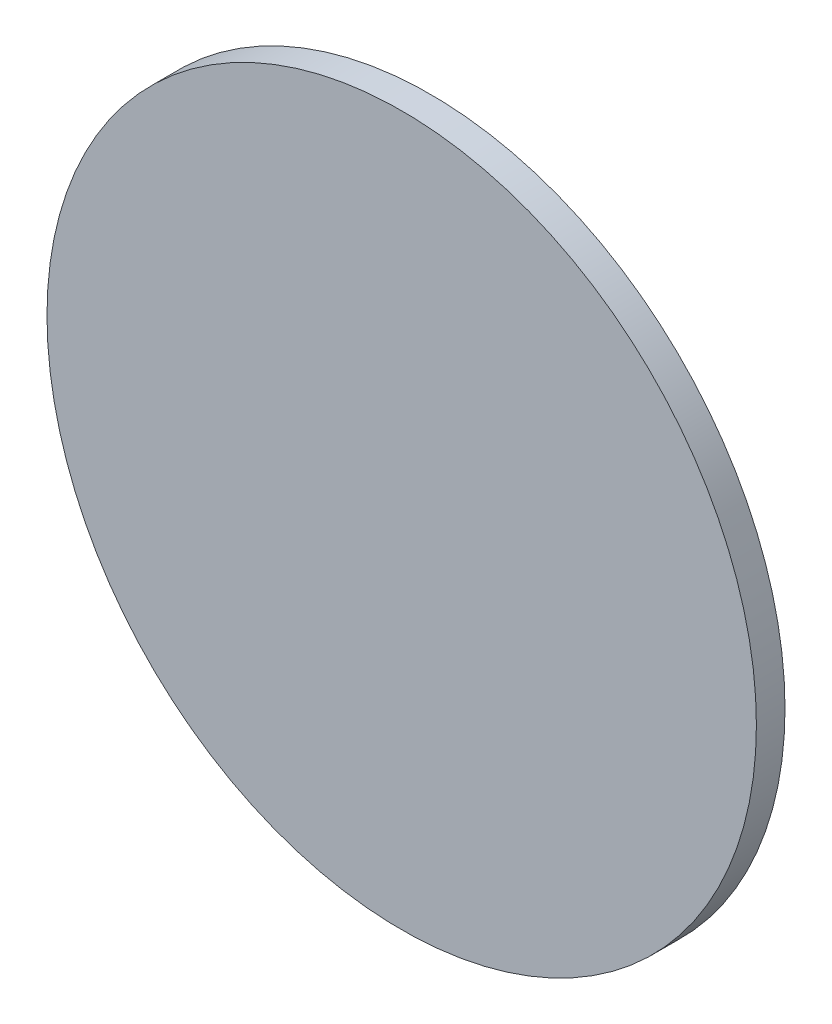
ISO-10303-21;
HEADER;
FILE_DESCRIPTION(('STEP AP214'),'2;1');
FILE_NAME('part.step','',(''),(''),'','','');
FILE_SCHEMA(('AUTOMOTIVE_DESIGN { 1 0 10303 214 1 1 1 1 }'));
ENDSEC;
DATA;
#1=APPLICATION_CONTEXT('core data for automotive mechanical design processes');
#2=APPLICATION_PROTOCOL_DEFINITION('international standard','automotive_design',2000,#1);
#3=PRODUCT_CONTEXT('',#1,'mechanical');
#4=PRODUCT('Part','Part','',(#3));
#5=PRODUCT_RELATED_PRODUCT_CATEGORY('part','',(#4));
#6=PRODUCT_DEFINITION_FORMATION('','',#4);
#7=PRODUCT_DEFINITION_CONTEXT('part definition',#1,'design');
#8=PRODUCT_DEFINITION('design','',#6,#7);
#9=PRODUCT_DEFINITION_SHAPE('','',#8);
#10=(LENGTH_UNIT() NAMED_UNIT(*) SI_UNIT(.MILLI.,.METRE.));
#11=(NAMED_UNIT(*) PLANE_ANGLE_UNIT() SI_UNIT($,.RADIAN.));
#12=(NAMED_UNIT(*) SI_UNIT($,.STERADIAN.) SOLID_ANGLE_UNIT());
#13=UNCERTAINTY_MEASURE_WITH_UNIT(LENGTH_MEASURE(1.E-05),#10,'distance_accuracy_value','');
#14=(GEOMETRIC_REPRESENTATION_CONTEXT(3) GLOBAL_UNCERTAINTY_ASSIGNED_CONTEXT((#13)) GLOBAL_UNIT_ASSIGNED_CONTEXT((#10,
#11,#12)) REPRESENTATION_CONTEXT('',''));
#15=CARTESIAN_POINT('',(0.,0.,0.));
#16=DIRECTION('',(0.,0.,1.));
#17=DIRECTION('',(1.,0.,0.));
#18=AXIS2_PLACEMENT_3D('',#15,#16,#17);
#19=CARTESIAN_POINT('',(62.,0.,0.));
#20=DIRECTION('',(0.,0.,-1.));
#21=DIRECTION('',(-1.,0.,0.));
#22=AXIS2_PLACEMENT_3D('',#19,#20,#21);
#23=PLANE('',#22);
#24=CARTESIAN_POINT('',(0.,0.,0.));
#25=DIRECTION('',(0.,0.,-1.));
#26=DIRECTION('',(-1.,0.,0.));
#27=AXIS2_PLACEMENT_3D('',#24,#25,#26);
#28=CIRCLE('',#27,62.);
#29=CARTESIAN_POINT('',(-62.,0.,0.));
#30=VERTEX_POINT('',#29);
#31=EDGE_CURVE('E80',#30,#30,#28,.T.);
#32=ORIENTED_EDGE('',*,*,#31,.F.);
#33=EDGE_LOOP('',(#32));
#34=FACE_BOUND('',#33,.T.);
#35=ADVANCED_FACE('F37',(#34),#23,.F.);
#36=CARTESIAN_POINT('',(0.,0.,-5.));
#37=DIRECTION('',(0.,0.,1.));
#38=DIRECTION('',(1.,0.,0.));
#39=AXIS2_PLACEMENT_3D('',#36,#37,#38);
#40=PLANE('',#39);
#41=CARTESIAN_POINT('',(0.,0.,-5.));
#42=DIRECTION('',(0.,0.,-1.));
#43=DIRECTION('',(-1.,0.,0.));
#44=AXIS2_PLACEMENT_3D('',#41,#42,#43);
#45=CIRCLE('',#44,38.95);
#46=CARTESIAN_POINT('',(-38.95,0.,-5.));
#47=VERTEX_POINT('',#46);
#48=EDGE_CURVE('E10',#47,#47,#45,.T.);
#49=ORIENTED_EDGE('',*,*,#48,.T.);
#50=EDGE_LOOP('',(#49));
#51=FACE_BOUND('',#50,.T.);
#52=ADVANCED_FACE('F88',(#51),#40,.F.);
#53=CARTESIAN_POINT('',(0.,0.,0.));
#54=DIRECTION('',(0.,0.,-1.));
#55=DIRECTION('',(-1.,0.,0.));
#56=AXIS2_PLACEMENT_3D('',#53,#54,#55);
#57=CYLINDRICAL_SURFACE('',#56,38.95);
#58=ORIENTED_EDGE('',*,*,#48,.F.);
#59=EDGE_LOOP('',(#58));
#60=FACE_BOUND('',#59,.T.);
#61=CARTESIAN_POINT('',(0.,0.,-2.));
#62=DIRECTION('',(0.,0.,-1.));
#63=DIRECTION('',(-1.,0.,0.));
#64=AXIS2_PLACEMENT_3D('',#61,#62,#63);
#65=CIRCLE('',#64,38.95);
#66=CARTESIAN_POINT('',(-38.95,0.,-2.));
#67=VERTEX_POINT('',#66);
#68=EDGE_CURVE('E44',#67,#67,#65,.T.);
#69=ORIENTED_EDGE('',*,*,#68,.T.);
#70=EDGE_LOOP('',(#69));
#71=FACE_BOUND('',#70,.T.);
#72=ADVANCED_FACE('F92',(#60,#71),#57,.T.);
#73=CARTESIAN_POINT('',(38.95,0.,-2.));
#74=DIRECTION('',(0.,0.,1.));
#75=DIRECTION('',(1.,0.,0.));
#76=AXIS2_PLACEMENT_3D('',#73,#74,#75);
#77=PLANE('',#76);
#78=ORIENTED_EDGE('',*,*,#68,.F.);
#79=EDGE_LOOP('',(#78));
#80=FACE_BOUND('',#79,.T.);
#81=CARTESIAN_POINT('',(0.,0.,-2.));
#82=DIRECTION('',(0.,0.,-1.));
#83=DIRECTION('',(-1.,0.,0.));
#84=AXIS2_PLACEMENT_3D('',#81,#82,#83);
#85=CIRCLE('',#84,44.45);
#86=CARTESIAN_POINT('',(-44.45,0.,-2.));
#87=VERTEX_POINT('',#86);
#88=EDGE_CURVE('E49',#87,#87,#85,.T.);
#89=ORIENTED_EDGE('',*,*,#88,.T.);
#90=EDGE_LOOP('',(#89));
#91=FACE_BOUND('',#90,.T.);
#92=ADVANCED_FACE('F96',(#80,#91),#77,.F.);
#93=CARTESIAN_POINT('',(0.,0.,0.));
#94=DIRECTION('',(0.,0.,-1.));
#95=DIRECTION('',(-1.,0.,0.));
#96=AXIS2_PLACEMENT_3D('',#93,#94,#95);
#97=CYLINDRICAL_SURFACE('',#96,44.45);
#98=ORIENTED_EDGE('',*,*,#88,.F.);
#99=EDGE_LOOP('',(#98));
#100=FACE_BOUND('',#99,.T.);
#101=CARTESIAN_POINT('',(0.,0.,-5.));
#102=DIRECTION('',(0.,0.,-1.));
#103=DIRECTION('',(-1.,0.,0.));
#104=AXIS2_PLACEMENT_3D('',#101,#102,#103);
#105=CIRCLE('',#104,44.45);
#106=CARTESIAN_POINT('',(-44.45,0.,-5.));
#107=VERTEX_POINT('',#106);
#108=EDGE_CURVE('E54',#107,#107,#105,.T.);
#109=ORIENTED_EDGE('',*,*,#108,.T.);
#110=EDGE_LOOP('',(#109));
#111=FACE_BOUND('',#110,.T.);
#112=ADVANCED_FACE('F102',(#100,#111),#97,.F.);
#113=CARTESIAN_POINT('',(44.45,0.,-5.));
#114=DIRECTION('',(0.,0.,1.));
#115=DIRECTION('',(1.,0.,0.));
#116=AXIS2_PLACEMENT_3D('',#113,#114,#115);
#117=PLANE('',#116);
#118=ORIENTED_EDGE('',*,*,#108,.F.);
#119=EDGE_LOOP('',(#118));
#120=FACE_BOUND('',#119,.T.);
#121=CARTESIAN_POINT('',(0.,0.,-5.));
#122=DIRECTION('',(0.,0.,-1.));
#123=DIRECTION('',(-1.,0.,0.));
#124=AXIS2_PLACEMENT_3D('',#121,#122,#123);
#125=CIRCLE('',#124,51.);
#126=CARTESIAN_POINT('',(-51.,0.,-5.));
#127=VERTEX_POINT('',#126);
#128=EDGE_CURVE('E60',#127,#127,#125,.T.);
#129=ORIENTED_EDGE('',*,*,#128,.T.);
#130=EDGE_LOOP('',(#129));
#131=FACE_BOUND('',#130,.T.);
#132=ADVANCED_FACE('F106',(#120,#131),#117,.F.);
#133=CARTESIAN_POINT('',(0.,0.,0.));
#134=DIRECTION('',(0.,0.,-1.));
#135=DIRECTION('',(-1.,0.,0.));
#136=AXIS2_PLACEMENT_3D('',#133,#134,#135);
#137=CYLINDRICAL_SURFACE('',#136,51.);
#138=ORIENTED_EDGE('',*,*,#128,.F.);
#139=EDGE_LOOP('',(#138));
#140=FACE_BOUND('',#139,.T.);
#141=CARTESIAN_POINT('',(0.,0.,-2.));
#142=DIRECTION('',(0.,0.,-1.));
#143=DIRECTION('',(-1.,0.,0.));
#144=AXIS2_PLACEMENT_3D('',#141,#142,#143);
#145=CIRCLE('',#144,51.);
#146=CARTESIAN_POINT('',(-51.,0.,-2.));
#147=VERTEX_POINT('',#146);
#148=EDGE_CURVE('E64',#147,#147,#145,.T.);
#149=ORIENTED_EDGE('',*,*,#148,.T.);
#150=EDGE_LOOP('',(#149));
#151=FACE_BOUND('',#150,.T.);
#152=ADVANCED_FACE('F110',(#140,#151),#137,.T.);
#153=CARTESIAN_POINT('',(51.,0.,-2.));
#154=DIRECTION('',(0.,0.,1.));
#155=DIRECTION('',(1.,0.,0.));
#156=AXIS2_PLACEMENT_3D('',#153,#154,#155);
#157=PLANE('',#156);
#158=ORIENTED_EDGE('',*,*,#148,.F.);
#159=EDGE_LOOP('',(#158));
#160=FACE_BOUND('',#159,.T.);
#161=CARTESIAN_POINT('',(0.,0.,-2.));
#162=DIRECTION('',(0.,0.,-1.));
#163=DIRECTION('',(-1.,0.,0.));
#164=AXIS2_PLACEMENT_3D('',#161,#162,#163);
#165=CIRCLE('',#164,57.);
#166=CARTESIAN_POINT('',(-57.,0.,-2.));
#167=VERTEX_POINT('',#166);
#168=EDGE_CURVE('E68',#167,#167,#165,.T.);
#169=ORIENTED_EDGE('',*,*,#168,.T.);
#170=EDGE_LOOP('',(#169));
#171=FACE_BOUND('',#170,.T.);
#172=ADVANCED_FACE('F114',(#160,#171),#157,.F.);
#173=CARTESIAN_POINT('',(0.,0.,0.));
#174=DIRECTION('',(0.,0.,-1.));
#175=DIRECTION('',(-1.,0.,0.));
#176=AXIS2_PLACEMENT_3D('',#173,#174,#175);
#177=CYLINDRICAL_SURFACE('',#176,57.);
#178=ORIENTED_EDGE('',*,*,#168,.F.);
#179=EDGE_LOOP('',(#178));
#180=FACE_BOUND('',#179,.T.);
#181=CARTESIAN_POINT('',(0.,0.,-5.));
#182=DIRECTION('',(0.,0.,-1.));
#183=DIRECTION('',(-1.,0.,0.));
#184=AXIS2_PLACEMENT_3D('',#181,#182,#183);
#185=CIRCLE('',#184,57.);
#186=CARTESIAN_POINT('',(-57.,0.,-5.));
#187=VERTEX_POINT('',#186);
#188=EDGE_CURVE('E72',#187,#187,#185,.T.);
#189=ORIENTED_EDGE('',*,*,#188,.T.);
#190=EDGE_LOOP('',(#189));
#191=FACE_BOUND('',#190,.T.);
#192=ADVANCED_FACE('F118',(#180,#191),#177,.F.);
#193=CARTESIAN_POINT('',(57.,0.,-5.));
#194=DIRECTION('',(0.,0.,1.));
#195=DIRECTION('',(1.,0.,0.));
#196=AXIS2_PLACEMENT_3D('',#193,#194,#195);
#197=PLANE('',#196);
#198=ORIENTED_EDGE('',*,*,#188,.F.);
#199=EDGE_LOOP('',(#198));
#200=FACE_BOUND('',#199,.T.);
#201=CARTESIAN_POINT('',(0.,0.,-5.));
#202=DIRECTION('',(0.,0.,-1.));
#203=DIRECTION('',(-1.,0.,0.));
#204=AXIS2_PLACEMENT_3D('',#201,#202,#203);
#205=CIRCLE('',#204,62.);
#206=CARTESIAN_POINT('',(-62.,0.,-5.));
#207=VERTEX_POINT('',#206);
#208=EDGE_CURVE('E76',#207,#207,#205,.T.);
#209=ORIENTED_EDGE('',*,*,#208,.T.);
#210=EDGE_LOOP('',(#209));
#211=FACE_BOUND('',#210,.T.);
#212=ADVANCED_FACE('F122',(#200,#211),#197,.F.);
#213=CARTESIAN_POINT('',(0.,0.,0.));
#214=DIRECTION('',(0.,0.,-1.));
#215=DIRECTION('',(-1.,0.,0.));
#216=AXIS2_PLACEMENT_3D('',#213,#214,#215);
#217=CYLINDRICAL_SURFACE('',#216,62.);
#218=ORIENTED_EDGE('',*,*,#208,.F.);
#219=EDGE_LOOP('',(#218));
#220=FACE_BOUND('',#219,.T.);
#221=ORIENTED_EDGE('',*,*,#31,.T.);
#222=EDGE_LOOP('',(#221));
#223=FACE_BOUND('',#222,.T.);
#224=ADVANCED_FACE('F85',(#220,#223),#217,.T.);
#225=CLOSED_SHELL('',(#35,#52,#72,#92,#112,#132,#152,#172,#192,#212,#224));
#226=MANIFOLD_SOLID_BREP('B2',#225);
#227=ADVANCED_BREP_SHAPE_REPRESENTATION('',(#18,#226),#14);
#228=SHAPE_DEFINITION_REPRESENTATION(#9,#227);
ENDSEC;
END-ISO-10303-21;
